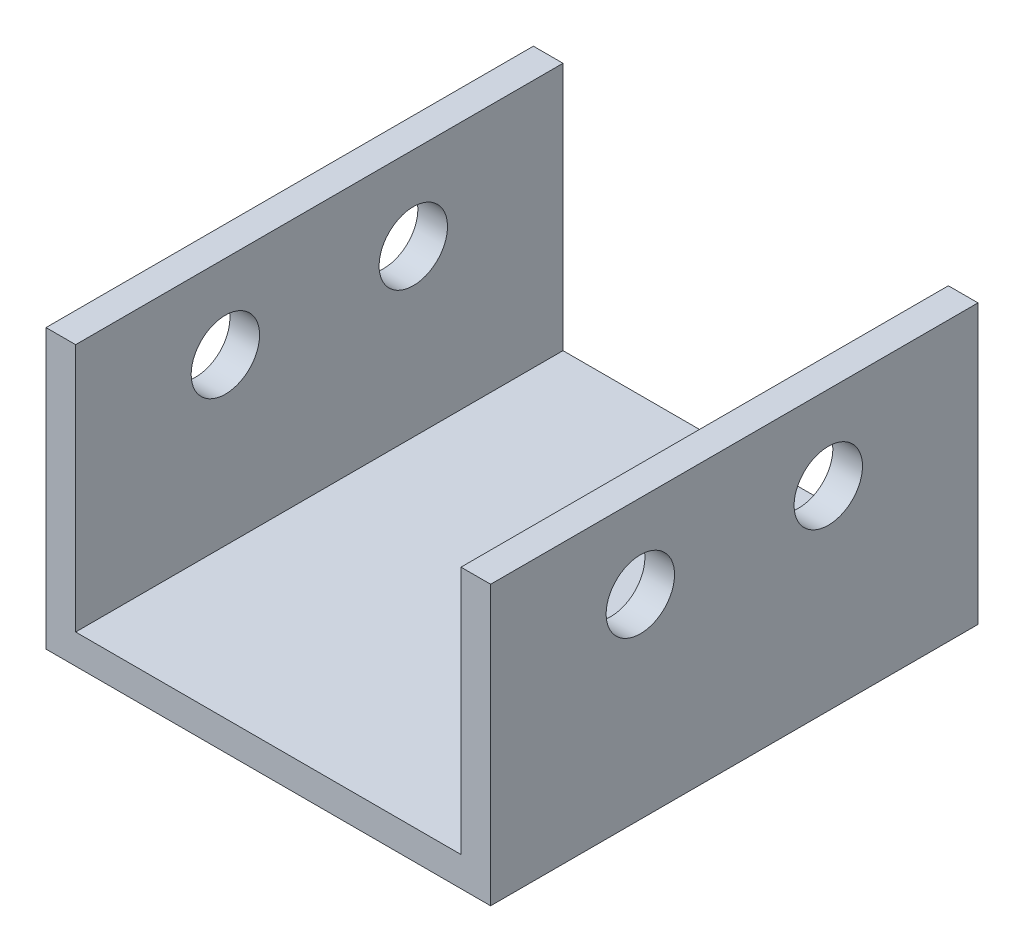
ISO-10303-21;
HEADER;
FILE_DESCRIPTION(('STEP AP214'),'2;1');
FILE_NAME('part.step','',(''),(''),'','','');
FILE_SCHEMA(('AUTOMOTIVE_DESIGN { 1 0 10303 214 1 1 1 1 }'));
ENDSEC;
DATA;
#1=APPLICATION_CONTEXT('core data for automotive mechanical design processes');
#2=APPLICATION_PROTOCOL_DEFINITION('international standard','automotive_design',2000,#1);
#3=PRODUCT_CONTEXT('',#1,'mechanical');
#4=PRODUCT('Part','Part','',(#3));
#5=PRODUCT_RELATED_PRODUCT_CATEGORY('part','',(#4));
#6=PRODUCT_DEFINITION_FORMATION('','',#4);
#7=PRODUCT_DEFINITION_CONTEXT('part definition',#1,'design');
#8=PRODUCT_DEFINITION('design','',#6,#7);
#9=PRODUCT_DEFINITION_SHAPE('','',#8);
#10=(LENGTH_UNIT() NAMED_UNIT(*) SI_UNIT(.MILLI.,.METRE.));
#11=(NAMED_UNIT(*) PLANE_ANGLE_UNIT() SI_UNIT($,.RADIAN.));
#12=(NAMED_UNIT(*) SI_UNIT($,.STERADIAN.) SOLID_ANGLE_UNIT());
#13=UNCERTAINTY_MEASURE_WITH_UNIT(LENGTH_MEASURE(1.E-05),#10,'distance_accuracy_value','');
#14=(GEOMETRIC_REPRESENTATION_CONTEXT(3) GLOBAL_UNCERTAINTY_ASSIGNED_CONTEXT((#13)) GLOBAL_UNIT_ASSIGNED_CONTEXT((#10,
#11,#12)) REPRESENTATION_CONTEXT('',''));
#15=CARTESIAN_POINT('',(0.,0.,0.));
#16=DIRECTION('',(0.,0.,1.));
#17=DIRECTION('',(1.,0.,0.));
#18=AXIS2_PLACEMENT_3D('',#15,#16,#17);
#19=CARTESIAN_POINT('',(26.,0.,28.5));
#20=DIRECTION('',(-1.,0.,0.));
#21=DIRECTION('',(0.,-1.,0.));
#22=AXIS2_PLACEMENT_3D('',#19,#20,#21);
#23=PLANE('',#22);
#24=CARTESIAN_POINT('',(26.,22.8,10.99));
#25=DIRECTION('',(1.,0.,0.));
#26=DIRECTION('',(0.,1.,0.));
#27=AXIS2_PLACEMENT_3D('',#24,#25,#26);
#28=CIRCLE('',#27,4.);
#29=CARTESIAN_POINT('',(26.,26.8,10.99));
#30=VERTEX_POINT('',#29);
#31=EDGE_CURVE('E201',#30,#30,#28,.T.);
#32=ORIENTED_EDGE('',*,*,#31,.F.);
#33=EDGE_LOOP('',(#32));
#34=FACE_BOUND('',#33,.T.);
#35=CARTESIAN_POINT('',(26.,22.8,-10.99));
#36=DIRECTION('',(1.,0.,0.));
#37=DIRECTION('',(0.,-1.,0.));
#38=AXIS2_PLACEMENT_3D('',#35,#36,#37);
#39=CIRCLE('',#38,4.);
#40=CARTESIAN_POINT('',(26.,18.8,-10.99));
#41=VERTEX_POINT('',#40);
#42=EDGE_CURVE('E198',#41,#41,#39,.T.);
#43=ORIENTED_EDGE('',*,*,#42,.F.);
#44=EDGE_LOOP('',(#43));
#45=FACE_BOUND('',#44,.T.);
#46=DIRECTION('',(0.,1.,0.));
#47=VECTOR('',#46,1.);
#48=CARTESIAN_POINT('',(26.,0.,-28.5));
#49=LINE('',#48,#47);
#50=CARTESIAN_POINT('',(26.,0.,-28.5));
#51=VERTEX_POINT('',#50);
#52=CARTESIAN_POINT('',(26.,32.5714285714286,-28.5));
#53=VERTEX_POINT('',#52);
#54=EDGE_CURVE('E135',#51,#53,#49,.T.);
#55=ORIENTED_EDGE('',*,*,#54,.T.);
#56=DIRECTION('',(0.,0.,-1.));
#57=VECTOR('',#56,1.);
#58=CARTESIAN_POINT('',(26.,32.5714285714286,28.5));
#59=LINE('',#58,#57);
#60=CARTESIAN_POINT('',(26.,32.5714285714286,28.5));
#61=VERTEX_POINT('',#60);
#62=EDGE_CURVE('E11',#61,#53,#59,.T.);
#63=ORIENTED_EDGE('',*,*,#62,.F.);
#64=DIRECTION('',(0.,1.,0.));
#65=VECTOR('',#64,1.);
#66=CARTESIAN_POINT('',(26.,0.,28.5));
#67=LINE('',#66,#65);
#68=CARTESIAN_POINT('',(26.,0.,28.5));
#69=VERTEX_POINT('',#68);
#70=EDGE_CURVE('E150',#69,#61,#67,.T.);
#71=ORIENTED_EDGE('',*,*,#70,.F.);
#72=DIRECTION('',(0.,0.,-1.));
#73=VECTOR('',#72,1.);
#74=CARTESIAN_POINT('',(26.,0.,28.5));
#75=LINE('',#74,#73);
#76=EDGE_CURVE('E131',#69,#51,#75,.T.);
#77=ORIENTED_EDGE('',*,*,#76,.T.);
#78=EDGE_LOOP('',(#55,#63,#71,#77));
#79=FACE_BOUND('',#78,.T.);
#80=ADVANCED_FACE('F39',(#34,#45,#79),#23,.F.);
#81=CARTESIAN_POINT('',(26.,32.5714285714286,28.5));
#82=DIRECTION('',(0.,-1.,0.));
#83=DIRECTION('',(1.,0.,0.));
#84=AXIS2_PLACEMENT_3D('',#81,#82,#83);
#85=PLANE('',#84);
#86=DIRECTION('',(-1.,0.,0.));
#87=VECTOR('',#86,1.);
#88=CARTESIAN_POINT('',(26.,32.5714285714286,-28.5));
#89=LINE('',#88,#87);
#90=CARTESIAN_POINT('',(22.5333333333333,32.5714285714286,-28.5));
#91=VERTEX_POINT('',#90);
#92=EDGE_CURVE('E138',#53,#91,#89,.T.);
#93=ORIENTED_EDGE('',*,*,#92,.T.);
#94=DIRECTION('',(0.,0.,-1.));
#95=VECTOR('',#94,1.);
#96=CARTESIAN_POINT('',(22.5333333333333,32.5714285714286,28.5));
#97=LINE('',#96,#95);
#98=CARTESIAN_POINT('',(22.5333333333333,32.5714285714286,28.5));
#99=VERTEX_POINT('',#98);
#100=EDGE_CURVE('E47',#99,#91,#97,.T.);
#101=ORIENTED_EDGE('',*,*,#100,.F.);
#102=DIRECTION('',(-1.,0.,0.));
#103=VECTOR('',#102,1.);
#104=CARTESIAN_POINT('',(26.,32.5714285714286,28.5));
#105=LINE('',#104,#103);
#106=EDGE_CURVE('E98',#61,#99,#105,.T.);
#107=ORIENTED_EDGE('',*,*,#106,.F.);
#108=ORIENTED_EDGE('',*,*,#62,.T.);
#109=EDGE_LOOP('',(#93,#101,#107,#108));
#110=FACE_BOUND('',#109,.T.);
#111=ADVANCED_FACE('F236',(#110),#85,.F.);
#112=CARTESIAN_POINT('',(22.5333333333333,32.5714285714286,28.5));
#113=DIRECTION('',(1.,0.,0.));
#114=DIRECTION('',(0.,1.,0.));
#115=AXIS2_PLACEMENT_3D('',#112,#113,#114);
#116=PLANE('',#115);
#117=CARTESIAN_POINT('',(22.5333333333333,22.8,10.99));
#118=DIRECTION('',(1.,0.,0.));
#119=DIRECTION('',(0.,1.,0.));
#120=AXIS2_PLACEMENT_3D('',#117,#118,#119);
#121=CIRCLE('',#120,4.);
#122=CARTESIAN_POINT('',(22.5333333333333,26.8,10.99));
#123=VERTEX_POINT('',#122);
#124=EDGE_CURVE('E139',#123,#123,#121,.T.);
#125=ORIENTED_EDGE('',*,*,#124,.T.);
#126=EDGE_LOOP('',(#125));
#127=FACE_BOUND('',#126,.T.);
#128=CARTESIAN_POINT('',(22.5333333333333,22.8,-10.99));
#129=DIRECTION('',(1.,0.,0.));
#130=DIRECTION('',(0.,1.,0.));
#131=AXIS2_PLACEMENT_3D('',#128,#129,#130);
#132=CIRCLE('',#131,4.);
#133=CARTESIAN_POINT('',(22.5333333333333,26.8,-10.99));
#134=VERTEX_POINT('',#133);
#135=EDGE_CURVE('E188',#134,#134,#132,.T.);
#136=ORIENTED_EDGE('',*,*,#135,.T.);
#137=EDGE_LOOP('',(#136));
#138=FACE_BOUND('',#137,.T.);
#139=DIRECTION('',(0.,-1.,0.));
#140=VECTOR('',#139,1.);
#141=CARTESIAN_POINT('',(22.5333333333333,32.5714285714286,-28.5));
#142=LINE('',#141,#140);
#143=CARTESIAN_POINT('',(22.5333333333333,3.46666666666668,-28.5));
#144=VERTEX_POINT('',#143);
#145=EDGE_CURVE('E141',#91,#144,#142,.T.);
#146=ORIENTED_EDGE('',*,*,#145,.T.);
#147=DIRECTION('',(0.,0.,-1.));
#148=VECTOR('',#147,1.);
#149=CARTESIAN_POINT('',(22.5333333333333,3.46666666666668,28.5));
#150=LINE('',#149,#148);
#151=CARTESIAN_POINT('',(22.5333333333333,3.46666666666668,28.5));
#152=VERTEX_POINT('',#151);
#153=EDGE_CURVE('E157',#152,#144,#150,.T.);
#154=ORIENTED_EDGE('',*,*,#153,.F.);
#155=DIRECTION('',(0.,-1.,0.));
#156=VECTOR('',#155,1.);
#157=CARTESIAN_POINT('',(22.5333333333333,32.5714285714286,28.5));
#158=LINE('',#157,#156);
#159=EDGE_CURVE('E165',#99,#152,#158,.T.);
#160=ORIENTED_EDGE('',*,*,#159,.F.);
#161=ORIENTED_EDGE('',*,*,#100,.T.);
#162=EDGE_LOOP('',(#146,#154,#160,#161));
#163=FACE_BOUND('',#162,.T.);
#164=ADVANCED_FACE('F163',(#127,#138,#163),#116,.F.);
#165=CARTESIAN_POINT('',(22.5333333333333,3.46666666666668,28.5));
#166=DIRECTION('',(0.,-1.,0.));
#167=DIRECTION('',(1.,0.,0.));
#168=AXIS2_PLACEMENT_3D('',#165,#166,#167);
#169=PLANE('',#168);
#170=DIRECTION('',(-1.,0.,0.));
#171=VECTOR('',#170,1.);
#172=CARTESIAN_POINT('',(22.5333333333333,3.46666666666668,-28.5));
#173=LINE('',#172,#171);
#174=CARTESIAN_POINT('',(-22.5333333333333,3.46666666666668,-28.5));
#175=VERTEX_POINT('',#174);
#176=EDGE_CURVE('E143',#144,#175,#173,.T.);
#177=ORIENTED_EDGE('',*,*,#176,.T.);
#178=DIRECTION('',(0.,0.,-1.));
#179=VECTOR('',#178,1.);
#180=CARTESIAN_POINT('',(-22.5333333333333,3.46666666666668,28.5));
#181=LINE('',#180,#179);
#182=CARTESIAN_POINT('',(-22.5333333333333,3.46666666666668,28.5));
#183=VERTEX_POINT('',#182);
#184=EDGE_CURVE('E154',#183,#175,#181,.T.);
#185=ORIENTED_EDGE('',*,*,#184,.F.);
#186=DIRECTION('',(-1.,0.,0.));
#187=VECTOR('',#186,1.);
#188=CARTESIAN_POINT('',(22.5333333333333,3.46666666666668,28.5));
#189=LINE('',#188,#187);
#190=EDGE_CURVE('E177',#152,#183,#189,.T.);
#191=ORIENTED_EDGE('',*,*,#190,.F.);
#192=ORIENTED_EDGE('',*,*,#153,.T.);
#193=EDGE_LOOP('',(#177,#185,#191,#192));
#194=FACE_BOUND('',#193,.T.);
#195=ADVANCED_FACE('F173',(#194),#169,.F.);
#196=CARTESIAN_POINT('',(-22.5333333333333,3.46666666666668,28.5));
#197=DIRECTION('',(-1.,0.,0.));
#198=DIRECTION('',(0.,-1.,0.));
#199=AXIS2_PLACEMENT_3D('',#196,#197,#198);
#200=PLANE('',#199);
#201=CARTESIAN_POINT('',(-22.5333333333333,22.8,10.99));
#202=DIRECTION('',(-1.,0.,0.));
#203=DIRECTION('',(0.,-1.,0.));
#204=AXIS2_PLACEMENT_3D('',#201,#202,#203);
#205=CIRCLE('',#204,4.);
#206=CARTESIAN_POINT('',(-22.5333333333333,18.8,10.99));
#207=VERTEX_POINT('',#206);
#208=EDGE_CURVE('E185',#207,#207,#205,.T.);
#209=ORIENTED_EDGE('',*,*,#208,.T.);
#210=EDGE_LOOP('',(#209));
#211=FACE_BOUND('',#210,.T.);
#212=CARTESIAN_POINT('',(-22.5333333333333,22.8,-10.99));
#213=DIRECTION('',(-1.,0.,0.));
#214=DIRECTION('',(0.,-1.,0.));
#215=AXIS2_PLACEMENT_3D('',#212,#213,#214);
#216=CIRCLE('',#215,4.);
#217=CARTESIAN_POINT('',(-22.5333333333333,18.8,-10.99));
#218=VERTEX_POINT('',#217);
#219=EDGE_CURVE('E191',#218,#218,#216,.T.);
#220=ORIENTED_EDGE('',*,*,#219,.T.);
#221=EDGE_LOOP('',(#220));
#222=FACE_BOUND('',#221,.T.);
#223=DIRECTION('',(0.,1.,0.));
#224=VECTOR('',#223,1.);
#225=CARTESIAN_POINT('',(-22.5333333333333,3.46666666666668,-28.5));
#226=LINE('',#225,#224);
#227=CARTESIAN_POINT('',(-22.5333333333333,32.5714285714286,-28.5));
#228=VERTEX_POINT('',#227);
#229=EDGE_CURVE('E145',#175,#228,#226,.T.);
#230=ORIENTED_EDGE('',*,*,#229,.T.);
#231=DIRECTION('',(0.,0.,-1.));
#232=VECTOR('',#231,1.);
#233=CARTESIAN_POINT('',(-22.5333333333333,32.5714285714286,28.5));
#234=LINE('',#233,#232);
#235=CARTESIAN_POINT('',(-22.5333333333333,32.5714285714286,28.5));
#236=VERTEX_POINT('',#235);
#237=EDGE_CURVE('E126',#236,#228,#234,.T.);
#238=ORIENTED_EDGE('',*,*,#237,.F.);
#239=DIRECTION('',(0.,1.,0.));
#240=VECTOR('',#239,1.);
#241=CARTESIAN_POINT('',(-22.5333333333333,3.46666666666668,28.5));
#242=LINE('',#241,#240);
#243=EDGE_CURVE('E117',#183,#236,#242,.T.);
#244=ORIENTED_EDGE('',*,*,#243,.F.);
#245=ORIENTED_EDGE('',*,*,#184,.T.);
#246=EDGE_LOOP('',(#230,#238,#244,#245));
#247=FACE_BOUND('',#246,.T.);
#248=ADVANCED_FACE('F176',(#211,#222,#247),#200,.F.);
#249=CARTESIAN_POINT('',(-22.5333333333333,32.5714285714286,28.5));
#250=DIRECTION('',(0.,-1.,0.));
#251=DIRECTION('',(1.,0.,0.));
#252=AXIS2_PLACEMENT_3D('',#249,#250,#251);
#253=PLANE('',#252);
#254=DIRECTION('',(-1.,0.,0.));
#255=VECTOR('',#254,1.);
#256=CARTESIAN_POINT('',(-22.5333333333333,32.5714285714286,-28.5));
#257=LINE('',#256,#255);
#258=CARTESIAN_POINT('',(-26.,32.5714285714286,-28.5));
#259=VERTEX_POINT('',#258);
#260=EDGE_CURVE('E125',#228,#259,#257,.T.);
#261=ORIENTED_EDGE('',*,*,#260,.T.);
#262=DIRECTION('',(0.,0.,-1.));
#263=VECTOR('',#262,1.);
#264=CARTESIAN_POINT('',(-26.,32.5714285714286,28.5));
#265=LINE('',#264,#263);
#266=CARTESIAN_POINT('',(-26.,32.5714285714286,28.5));
#267=VERTEX_POINT('',#266);
#268=EDGE_CURVE('E122',#267,#259,#265,.T.);
#269=ORIENTED_EDGE('',*,*,#268,.F.);
#270=DIRECTION('',(-1.,0.,0.));
#271=VECTOR('',#270,1.);
#272=CARTESIAN_POINT('',(-22.5333333333333,32.5714285714286,28.5));
#273=LINE('',#272,#271);
#274=EDGE_CURVE('E111',#236,#267,#273,.T.);
#275=ORIENTED_EDGE('',*,*,#274,.F.);
#276=ORIENTED_EDGE('',*,*,#237,.T.);
#277=EDGE_LOOP('',(#261,#269,#275,#276));
#278=FACE_BOUND('',#277,.T.);
#279=ADVANCED_FACE('F123',(#278),#253,.F.);
#280=CARTESIAN_POINT('',(-26.,32.5714285714286,28.5));
#281=DIRECTION('',(1.,0.,0.));
#282=DIRECTION('',(0.,1.,0.));
#283=AXIS2_PLACEMENT_3D('',#280,#281,#282);
#284=PLANE('',#283);
#285=CARTESIAN_POINT('',(-26.,22.8,10.99));
#286=DIRECTION('',(1.,0.,0.));
#287=DIRECTION('',(0.,1.,0.));
#288=AXIS2_PLACEMENT_3D('',#285,#286,#287);
#289=CIRCLE('',#288,4.);
#290=CARTESIAN_POINT('',(-26.,26.8,10.99));
#291=VERTEX_POINT('',#290);
#292=EDGE_CURVE('E194',#291,#291,#289,.T.);
#293=ORIENTED_EDGE('',*,*,#292,.T.);
#294=EDGE_LOOP('',(#293));
#295=FACE_BOUND('',#294,.T.);
#296=CARTESIAN_POINT('',(-26.,22.8,-10.99));
#297=DIRECTION('',(1.,0.,0.));
#298=DIRECTION('',(0.,-1.,0.));
#299=AXIS2_PLACEMENT_3D('',#296,#297,#298);
#300=CIRCLE('',#299,4.);
#301=CARTESIAN_POINT('',(-26.,18.8,-10.99));
#302=VERTEX_POINT('',#301);
#303=EDGE_CURVE('E195',#302,#302,#300,.T.);
#304=ORIENTED_EDGE('',*,*,#303,.T.);
#305=EDGE_LOOP('',(#304));
#306=FACE_BOUND('',#305,.T.);
#307=DIRECTION('',(0.,-1.,0.));
#308=VECTOR('',#307,1.);
#309=CARTESIAN_POINT('',(-26.,32.5714285714286,-28.5));
#310=LINE('',#309,#308);
#311=CARTESIAN_POINT('',(-26.,0.,-28.5));
#312=VERTEX_POINT('',#311);
#313=EDGE_CURVE('E84',#259,#312,#310,.T.);
#314=ORIENTED_EDGE('',*,*,#313,.T.);
#315=DIRECTION('',(0.,0.,-1.));
#316=VECTOR('',#315,1.);
#317=CARTESIAN_POINT('',(-26.,0.,28.5));
#318=LINE('',#317,#316);
#319=CARTESIAN_POINT('',(-26.,0.,28.5));
#320=VERTEX_POINT('',#319);
#321=EDGE_CURVE('E127',#320,#312,#318,.T.);
#322=ORIENTED_EDGE('',*,*,#321,.F.);
#323=DIRECTION('',(0.,-1.,0.));
#324=VECTOR('',#323,1.);
#325=CARTESIAN_POINT('',(-26.,32.5714285714286,28.5));
#326=LINE('',#325,#324);
#327=EDGE_CURVE('E115',#267,#320,#326,.T.);
#328=ORIENTED_EDGE('',*,*,#327,.F.);
#329=ORIENTED_EDGE('',*,*,#268,.T.);
#330=EDGE_LOOP('',(#314,#322,#328,#329));
#331=FACE_BOUND('',#330,.T.);
#332=ADVANCED_FACE('F129',(#295,#306,#331),#284,.F.);
#333=CARTESIAN_POINT('',(-26.,0.,28.5));
#334=DIRECTION('',(0.,1.,0.));
#335=DIRECTION('',(-1.,0.,0.));
#336=AXIS2_PLACEMENT_3D('',#333,#334,#335);
#337=PLANE('',#336);
#338=DIRECTION('',(1.,0.,0.));
#339=VECTOR('',#338,1.);
#340=CARTESIAN_POINT('',(-26.,0.,-28.5));
#341=LINE('',#340,#339);
#342=EDGE_CURVE('E90',#312,#51,#341,.T.);
#343=ORIENTED_EDGE('',*,*,#342,.T.);
#344=ORIENTED_EDGE('',*,*,#76,.F.);
#345=DIRECTION('',(1.,0.,0.));
#346=VECTOR('',#345,1.);
#347=CARTESIAN_POINT('',(-26.,0.,28.5));
#348=LINE('',#347,#346);
#349=EDGE_CURVE('E55',#320,#69,#348,.T.);
#350=ORIENTED_EDGE('',*,*,#349,.F.);
#351=ORIENTED_EDGE('',*,*,#321,.T.);
#352=EDGE_LOOP('',(#343,#344,#350,#351));
#353=FACE_BOUND('',#352,.T.);
#354=ADVANCED_FACE('F248',(#353),#337,.F.);
#355=CARTESIAN_POINT('',(0.,0.,28.5));
#356=DIRECTION('',(0.,0.,1.));
#357=DIRECTION('',(1.,0.,0.));
#358=AXIS2_PLACEMENT_3D('',#355,#356,#357);
#359=PLANE('',#358);
#360=ORIENTED_EDGE('',*,*,#70,.T.);
#361=ORIENTED_EDGE('',*,*,#106,.T.);
#362=ORIENTED_EDGE('',*,*,#159,.T.);
#363=ORIENTED_EDGE('',*,*,#190,.T.);
#364=ORIENTED_EDGE('',*,*,#243,.T.);
#365=ORIENTED_EDGE('',*,*,#274,.T.);
#366=ORIENTED_EDGE('',*,*,#327,.T.);
#367=ORIENTED_EDGE('',*,*,#349,.T.);
#368=EDGE_LOOP('',(#360,#361,#362,#363,#364,#365,#366,#367));
#369=FACE_BOUND('',#368,.T.);
#370=ADVANCED_FACE('F113',(#369),#359,.T.);
#371=CARTESIAN_POINT('',(0.,0.,-28.5));
#372=DIRECTION('',(0.,0.,1.));
#373=DIRECTION('',(1.,0.,0.));
#374=AXIS2_PLACEMENT_3D('',#371,#372,#373);
#375=PLANE('',#374);
#376=ORIENTED_EDGE('',*,*,#54,.F.);
#377=ORIENTED_EDGE('',*,*,#342,.F.);
#378=ORIENTED_EDGE('',*,*,#313,.F.);
#379=ORIENTED_EDGE('',*,*,#260,.F.);
#380=ORIENTED_EDGE('',*,*,#229,.F.);
#381=ORIENTED_EDGE('',*,*,#176,.F.);
#382=ORIENTED_EDGE('',*,*,#145,.F.);
#383=ORIENTED_EDGE('',*,*,#92,.F.);
#384=EDGE_LOOP('',(#376,#377,#378,#379,#380,#381,#382,#383));
#385=FACE_BOUND('',#384,.T.);
#386=ADVANCED_FACE('F169',(#385),#375,.F.);
#387=CARTESIAN_POINT('',(-26.,22.8,-10.99));
#388=DIRECTION('',(1.,0.,0.));
#389=DIRECTION('',(0.,1.,0.));
#390=AXIS2_PLACEMENT_3D('',#387,#388,#389);
#391=CYLINDRICAL_SURFACE('',#390,4.);
#392=ORIENTED_EDGE('',*,*,#303,.F.);
#393=EDGE_LOOP('',(#392));
#394=FACE_BOUND('',#393,.T.);
#395=ORIENTED_EDGE('',*,*,#219,.F.);
#396=EDGE_LOOP('',(#395));
#397=FACE_BOUND('',#396,.T.);
#398=ADVANCED_FACE('F213',(#394,#397),#391,.F.);
#399=CARTESIAN_POINT('',(-26.,22.8,10.99));
#400=DIRECTION('',(1.,0.,0.));
#401=DIRECTION('',(0.,1.,0.));
#402=AXIS2_PLACEMENT_3D('',#399,#400,#401);
#403=CYLINDRICAL_SURFACE('',#402,4.);
#404=ORIENTED_EDGE('',*,*,#292,.F.);
#405=EDGE_LOOP('',(#404));
#406=FACE_BOUND('',#405,.T.);
#407=ORIENTED_EDGE('',*,*,#208,.F.);
#408=EDGE_LOOP('',(#407));
#409=FACE_BOUND('',#408,.T.);
#410=ADVANCED_FACE('F209',(#406,#409),#403,.F.);
#411=ORIENTED_EDGE('',*,*,#42,.T.);
#412=EDGE_LOOP('',(#411));
#413=FACE_BOUND('',#412,.T.);
#414=ORIENTED_EDGE('',*,*,#135,.F.);
#415=EDGE_LOOP('',(#414));
#416=FACE_BOUND('',#415,.T.);
#417=ADVANCED_FACE('F212',(#413,#416),#391,.F.);
#418=ORIENTED_EDGE('',*,*,#31,.T.);
#419=EDGE_LOOP('',(#418));
#420=FACE_BOUND('',#419,.T.);
#421=ORIENTED_EDGE('',*,*,#124,.F.);
#422=EDGE_LOOP('',(#421));
#423=FACE_BOUND('',#422,.T.);
#424=ADVANCED_FACE('F215',(#420,#423),#403,.F.);
#425=CLOSED_SHELL('',(#80,#111,#164,#195,#248,#279,#332,#354,#370,#386,#398,#410,#417,#424));
#426=MANIFOLD_SOLID_BREP('B2',#425);
#427=ADVANCED_BREP_SHAPE_REPRESENTATION('',(#18,#426),#14);
#428=SHAPE_DEFINITION_REPRESENTATION(#9,#427);
ENDSEC;
END-ISO-10303-21;
